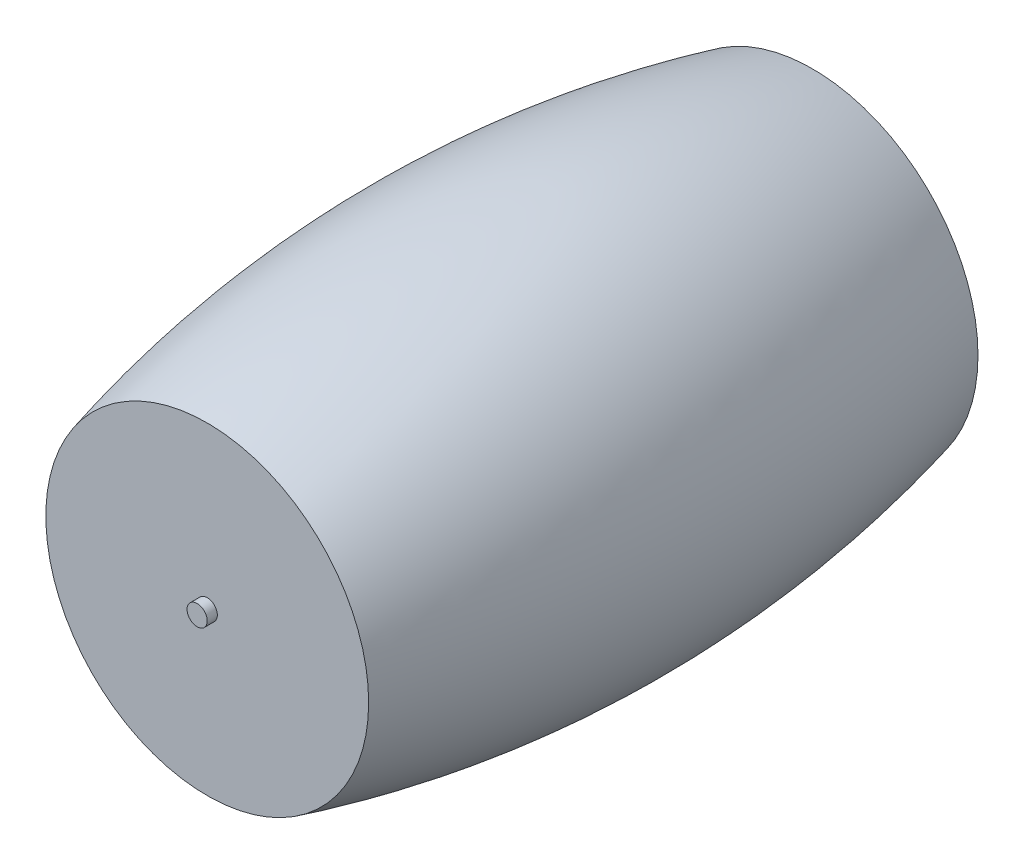
ISO-10303-21;
HEADER;
FILE_DESCRIPTION(('STEP AP214'),'2;1');
FILE_NAME('part.step','',(''),(''),'','','');
FILE_SCHEMA(('AUTOMOTIVE_DESIGN { 1 0 10303 214 1 1 1 1 }'));
ENDSEC;
DATA;
#1=APPLICATION_CONTEXT('core data for automotive mechanical design processes');
#2=APPLICATION_PROTOCOL_DEFINITION('international standard','automotive_design',2000,#1);
#3=PRODUCT_CONTEXT('',#1,'mechanical');
#4=PRODUCT('Part','Part','',(#3));
#5=PRODUCT_RELATED_PRODUCT_CATEGORY('part','',(#4));
#6=PRODUCT_DEFINITION_FORMATION('','',#4);
#7=PRODUCT_DEFINITION_CONTEXT('part definition',#1,'design');
#8=PRODUCT_DEFINITION('design','',#6,#7);
#9=PRODUCT_DEFINITION_SHAPE('','',#8);
#10=(LENGTH_UNIT() NAMED_UNIT(*) SI_UNIT(.MILLI.,.METRE.));
#11=(NAMED_UNIT(*) PLANE_ANGLE_UNIT() SI_UNIT($,.RADIAN.));
#12=(NAMED_UNIT(*) SI_UNIT($,.STERADIAN.) SOLID_ANGLE_UNIT());
#13=UNCERTAINTY_MEASURE_WITH_UNIT(LENGTH_MEASURE(1.E-05),#10,'distance_accuracy_value','');
#14=(GEOMETRIC_REPRESENTATION_CONTEXT(3) GLOBAL_UNCERTAINTY_ASSIGNED_CONTEXT((#13)) GLOBAL_UNIT_ASSIGNED_CONTEXT((#10,
#11,#12)) REPRESENTATION_CONTEXT('',''));
#15=CARTESIAN_POINT('',(0.,0.,0.));
#16=DIRECTION('',(0.,0.,1.));
#17=DIRECTION('',(1.,0.,0.));
#18=AXIS2_PLACEMENT_3D('',#15,#16,#17);
#19=CARTESIAN_POINT('',(0.,0.,-15.5));
#20=DIRECTION('',(0.,0.,1.));
#21=DIRECTION('',(1.,0.,0.));
#22=AXIS2_PLACEMENT_3D('',#19,#20,#21);
#23=PLANE('',#22);
#24=CARTESIAN_POINT('',(0.,0.,-15.5));
#25=DIRECTION('',(0.,0.,1.));
#26=DIRECTION('',(1.,0.,0.));
#27=AXIS2_PLACEMENT_3D('',#24,#25,#26);
#28=CIRCLE('',#27,0.5);
#29=CARTESIAN_POINT('',(0.5,0.,-15.5));
#30=VERTEX_POINT('',#29);
#31=EDGE_CURVE('E17',#30,#30,#28,.T.);
#32=ORIENTED_EDGE('',*,*,#31,.F.);
#33=EDGE_LOOP('',(#32));
#34=FACE_BOUND('',#33,.T.);
#35=ADVANCED_FACE('F14',(#34),#23,.F.);
#36=CARTESIAN_POINT('',(0.,0.,15.5));
#37=DIRECTION('',(0.,0.,1.));
#38=DIRECTION('',(1.,0.,0.));
#39=AXIS2_PLACEMENT_3D('',#36,#37,#38);
#40=PLANE('',#39);
#41=CARTESIAN_POINT('',(0.,0.,15.5));
#42=DIRECTION('',(0.,0.,1.));
#43=DIRECTION('',(1.,0.,0.));
#44=AXIS2_PLACEMENT_3D('',#41,#42,#43);
#45=CIRCLE('',#44,0.5);
#46=CARTESIAN_POINT('',(0.5,0.,15.5));
#47=VERTEX_POINT('',#46);
#48=EDGE_CURVE('E35',#47,#47,#45,.F.);
#49=ORIENTED_EDGE('',*,*,#48,.F.);
#50=EDGE_LOOP('',(#49));
#51=FACE_BOUND('',#50,.T.);
#52=ADVANCED_FACE('F45',(#51),#40,.T.);
#53=CARTESIAN_POINT('',(0.,0.,-15.5));
#54=DIRECTION('',(0.,0.,1.));
#55=DIRECTION('',(1.,0.,0.));
#56=AXIS2_PLACEMENT_3D('',#53,#54,#55);
#57=CYLINDRICAL_SURFACE('',#56,0.5);
#58=CARTESIAN_POINT('',(0.,0.,-15.));
#59=DIRECTION('',(0.,0.,1.));
#60=DIRECTION('',(1.,0.,0.));
#61=AXIS2_PLACEMENT_3D('',#58,#59,#60);
#62=CIRCLE('',#61,0.5);
#63=CARTESIAN_POINT('',(0.5,0.,-15.));
#64=VERTEX_POINT('',#63);
#65=EDGE_CURVE('E33',#64,#64,#62,.F.);
#66=ORIENTED_EDGE('',*,*,#65,.T.);
#67=EDGE_LOOP('',(#66));
#68=FACE_BOUND('',#67,.T.);
#69=ORIENTED_EDGE('',*,*,#31,.T.);
#70=EDGE_LOOP('',(#69));
#71=FACE_BOUND('',#70,.T.);
#72=ADVANCED_FACE('F42',(#68,#71),#57,.T.);
#73=CARTESIAN_POINT('',(0.,0.,-15.5));
#74=DIRECTION('',(0.,0.,1.));
#75=DIRECTION('',(1.,0.,0.));
#76=AXIS2_PLACEMENT_3D('',#73,#74,#75);
#77=CYLINDRICAL_SURFACE('',#76,0.5);
#78=CARTESIAN_POINT('',(0.,0.,15.));
#79=DIRECTION('',(0.,0.,1.));
#80=DIRECTION('',(1.,0.,0.));
#81=AXIS2_PLACEMENT_3D('',#78,#79,#80);
#82=CIRCLE('',#81,0.5);
#83=CARTESIAN_POINT('',(0.5,0.,15.));
#84=VERTEX_POINT('',#83);
#85=EDGE_CURVE('E26',#84,#84,#82,.T.);
#86=ORIENTED_EDGE('',*,*,#85,.T.);
#87=EDGE_LOOP('',(#86));
#88=FACE_BOUND('',#87,.T.);
#89=ORIENTED_EDGE('',*,*,#48,.T.);
#90=EDGE_LOOP('',(#89));
#91=FACE_BOUND('',#90,.T.);
#92=ADVANCED_FACE('F66',(#88,#91),#77,.T.);
#93=CARTESIAN_POINT('',(0.,0.,-15.));
#94=DIRECTION('',(0.,0.,1.));
#95=DIRECTION('',(1.,0.,0.));
#96=AXIS2_PLACEMENT_3D('',#93,#94,#95);
#97=PLANE('',#96);
#98=CARTESIAN_POINT('',(0.,0.,-15.));
#99=DIRECTION('',(0.,0.,1.));
#100=DIRECTION('',(1.,0.,0.));
#101=AXIS2_PLACEMENT_3D('',#98,#99,#100);
#102=CIRCLE('',#101,8.20051447417217);
#103=CARTESIAN_POINT('',(8.20051447417217,0.,-15.));
#104=VERTEX_POINT('',#103);
#105=EDGE_CURVE('E21',#104,#104,#102,.T.);
#106=ORIENTED_EDGE('',*,*,#105,.F.);
#107=EDGE_LOOP('',(#106));
#108=FACE_BOUND('',#107,.T.);
#109=ORIENTED_EDGE('',*,*,#65,.F.);
#110=EDGE_LOOP('',(#109));
#111=FACE_BOUND('',#110,.T.);
#112=ADVANCED_FACE('F59',(#108,#111),#97,.F.);
#113=CARTESIAN_POINT('',(0.,0.,15.));
#114=DIRECTION('',(0.,0.,-1.));
#115=DIRECTION('',(-1.,0.,0.));
#116=AXIS2_PLACEMENT_3D('',#113,#114,#115);
#117=PLANE('',#116);
#118=CARTESIAN_POINT('',(0.,0.,15.));
#119=DIRECTION('',(0.,0.,1.));
#120=DIRECTION('',(1.,0.,0.));
#121=AXIS2_PLACEMENT_3D('',#118,#119,#120);
#122=CIRCLE('',#121,8.00000000000001);
#123=CARTESIAN_POINT('',(8.00000000000001,0.,15.));
#124=VERTEX_POINT('',#123);
#125=EDGE_CURVE('E10',#124,#124,#122,.F.);
#126=ORIENTED_EDGE('',*,*,#125,.F.);
#127=EDGE_LOOP('',(#126));
#128=FACE_BOUND('',#127,.T.);
#129=ORIENTED_EDGE('',*,*,#85,.F.);
#130=EDGE_LOOP('',(#129));
#131=FACE_BOUND('',#130,.T.);
#132=ADVANCED_FACE('F53',(#128,#131),#117,.F.);
#133=CARTESIAN_POINT('',(-49.9931088468897,0.,-0.388285358440658));
#134=DIRECTION('',(0.,1.,0.));
#135=DIRECTION('',(1.,0.,0.));
#136=AXIS2_PLACEMENT_3D('',#133,#134,#135);
#137=CIRCLE('',#136,60.);
#138=TRIMMED_CURVE('',#137,(PARAMETER_VALUE(-0.585893287011539)),
(PARAMETER_VALUE(0.58589328701154)),.T.,.PARAMETER.);
#139=CARTESIAN_POINT('',(0.,0.,-0.388285358440658));
#140=DIRECTION('',(0.,0.,1.));
#141=AXIS1_PLACEMENT('',#139,#140);
#142=SURFACE_OF_REVOLUTION('',#138,#141);
#143=ORIENTED_EDGE('',*,*,#125,.T.);
#144=EDGE_LOOP('',(#143));
#145=FACE_BOUND('',#144,.T.);
#146=ORIENTED_EDGE('',*,*,#105,.T.);
#147=EDGE_LOOP('',(#146));
#148=FACE_BOUND('',#147,.T.);
#149=ADVANCED_FACE('F51',(#145,#148),#142,.F.);
#150=CLOSED_SHELL('',(#35,#52,#72,#92,#112,#132,#149));
#151=MANIFOLD_SOLID_BREP('B1',#150);
#152=ADVANCED_BREP_SHAPE_REPRESENTATION('',(#18,#151),#14);
#153=SHAPE_DEFINITION_REPRESENTATION(#9,#152);
ENDSEC;
END-ISO-10303-21;
